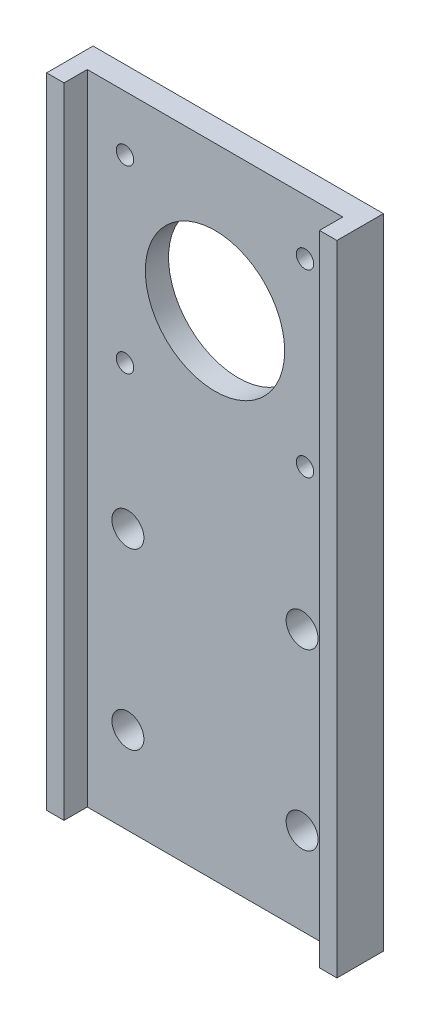
ISO-10303-21;
HEADER;
FILE_DESCRIPTION(('STEP AP214'),'2;1');
FILE_NAME('part.step','',(''),(''),'','','');
FILE_SCHEMA(('AUTOMOTIVE_DESIGN { 1 0 10303 214 1 1 1 1 }'));
ENDSEC;
DATA;
#1=APPLICATION_CONTEXT('core data for automotive mechanical design processes');
#2=APPLICATION_PROTOCOL_DEFINITION('international standard','automotive_design',2000,#1);
#3=PRODUCT_CONTEXT('',#1,'mechanical');
#4=PRODUCT('Part','Part','',(#3));
#5=PRODUCT_RELATED_PRODUCT_CATEGORY('part','',(#4));
#6=PRODUCT_DEFINITION_FORMATION('','',#4);
#7=PRODUCT_DEFINITION_CONTEXT('part definition',#1,'design');
#8=PRODUCT_DEFINITION('design','',#6,#7);
#9=PRODUCT_DEFINITION_SHAPE('','',#8);
#10=(LENGTH_UNIT() NAMED_UNIT(*) SI_UNIT(.MILLI.,.METRE.));
#11=(NAMED_UNIT(*) PLANE_ANGLE_UNIT() SI_UNIT($,.RADIAN.));
#12=(NAMED_UNIT(*) SI_UNIT($,.STERADIAN.) SOLID_ANGLE_UNIT());
#13=UNCERTAINTY_MEASURE_WITH_UNIT(LENGTH_MEASURE(1.E-05),#10,'distance_accuracy_value','');
#14=(GEOMETRIC_REPRESENTATION_CONTEXT(3) GLOBAL_UNCERTAINTY_ASSIGNED_CONTEXT((#13)) GLOBAL_UNIT_ASSIGNED_CONTEXT((#10,
#11,#12)) REPRESENTATION_CONTEXT('',''));
#15=CARTESIAN_POINT('',(0.,0.,0.));
#16=DIRECTION('',(0.,0.,1.));
#17=DIRECTION('',(1.,0.,0.));
#18=AXIS2_PLACEMENT_3D('',#15,#16,#17);
#19=CARTESIAN_POINT('',(0.,0.,4.));
#20=DIRECTION('',(0.,0.,1.));
#21=DIRECTION('',(1.,0.,0.));
#22=AXIS2_PLACEMENT_3D('',#19,#20,#21);
#23=PLANE('',#22);
#24=CARTESIAN_POINT('',(0.,30.,4.));
#25=DIRECTION('',(0.,0.,1.));
#26=DIRECTION('',(1.,0.,0.));
#27=AXIS2_PLACEMENT_3D('',#24,#25,#26);
#28=CIRCLE('',#27,12.);
#29=CARTESIAN_POINT('',(12.,30.,4.));
#30=VERTEX_POINT('',#29);
#31=EDGE_CURVE('E118',#30,#30,#28,.T.);
#32=ORIENTED_EDGE('',*,*,#31,.F.);
#33=EDGE_LOOP('',(#32));
#34=FACE_BOUND('',#33,.T.);
#35=CARTESIAN_POINT('',(15.,-9.99999999999999,4.));
#36=DIRECTION('',(0.,0.,1.));
#37=DIRECTION('',(1.,0.,0.));
#38=AXIS2_PLACEMENT_3D('',#35,#36,#37);
#39=CIRCLE('',#38,2.75);
#40=CARTESIAN_POINT('',(17.75,-9.99999999999999,4.));
#41=VERTEX_POINT('',#40);
#42=EDGE_CURVE('E153',#41,#41,#39,.T.);
#43=ORIENTED_EDGE('',*,*,#42,.F.);
#44=EDGE_LOOP('',(#43));
#45=FACE_BOUND('',#44,.T.);
#46=CARTESIAN_POINT('',(15.,-40.,4.));
#47=DIRECTION('',(0.,0.,1.));
#48=DIRECTION('',(1.,0.,0.));
#49=AXIS2_PLACEMENT_3D('',#46,#47,#48);
#50=CIRCLE('',#49,2.75);
#51=CARTESIAN_POINT('',(17.75,-40.,4.));
#52=VERTEX_POINT('',#51);
#53=EDGE_CURVE('E159',#52,#52,#50,.T.);
#54=ORIENTED_EDGE('',*,*,#53,.F.);
#55=EDGE_LOOP('',(#54));
#56=FACE_BOUND('',#55,.T.);
#57=CARTESIAN_POINT('',(-15.,-9.99999999999999,4.));
#58=DIRECTION('',(0.,0.,1.));
#59=DIRECTION('',(1.,0.,0.));
#60=AXIS2_PLACEMENT_3D('',#57,#58,#59);
#61=CIRCLE('',#60,2.75);
#62=CARTESIAN_POINT('',(-12.25,-9.99999999999999,4.));
#63=VERTEX_POINT('',#62);
#64=EDGE_CURVE('E165',#63,#63,#61,.T.);
#65=ORIENTED_EDGE('',*,*,#64,.F.);
#66=EDGE_LOOP('',(#65));
#67=FACE_BOUND('',#66,.T.);
#68=CARTESIAN_POINT('',(-15.,-40.,4.));
#69=DIRECTION('',(0.,0.,1.));
#70=DIRECTION('',(1.,0.,0.));
#71=AXIS2_PLACEMENT_3D('',#68,#69,#70);
#72=CIRCLE('',#71,2.75);
#73=CARTESIAN_POINT('',(-12.25,-40.,4.));
#74=VERTEX_POINT('',#73);
#75=EDGE_CURVE('E171',#74,#74,#72,.T.);
#76=ORIENTED_EDGE('',*,*,#75,.F.);
#77=EDGE_LOOP('',(#76));
#78=FACE_BOUND('',#77,.T.);
#79=CARTESIAN_POINT('',(15.5,45.5,4.));
#80=DIRECTION('',(0.,0.,1.));
#81=DIRECTION('',(1.,0.,0.));
#82=AXIS2_PLACEMENT_3D('',#79,#80,#81);
#83=CIRCLE('',#82,1.5);
#84=CARTESIAN_POINT('',(17.,45.5,4.));
#85=VERTEX_POINT('',#84);
#86=EDGE_CURVE('E177',#85,#85,#83,.T.);
#87=ORIENTED_EDGE('',*,*,#86,.F.);
#88=EDGE_LOOP('',(#87));
#89=FACE_BOUND('',#88,.T.);
#90=CARTESIAN_POINT('',(15.5,14.5,4.));
#91=DIRECTION('',(0.,0.,1.));
#92=DIRECTION('',(1.,0.,0.));
#93=AXIS2_PLACEMENT_3D('',#90,#91,#92);
#94=CIRCLE('',#93,1.5);
#95=CARTESIAN_POINT('',(17.,14.5,4.));
#96=VERTEX_POINT('',#95);
#97=EDGE_CURVE('E183',#96,#96,#94,.T.);
#98=ORIENTED_EDGE('',*,*,#97,.F.);
#99=EDGE_LOOP('',(#98));
#100=FACE_BOUND('',#99,.T.);
#101=CARTESIAN_POINT('',(-15.5,14.5,4.));
#102=DIRECTION('',(0.,0.,1.));
#103=DIRECTION('',(1.,0.,0.));
#104=AXIS2_PLACEMENT_3D('',#101,#102,#103);
#105=CIRCLE('',#104,1.5);
#106=CARTESIAN_POINT('',(-14.,14.5,4.));
#107=VERTEX_POINT('',#106);
#108=EDGE_CURVE('E189',#107,#107,#105,.T.);
#109=ORIENTED_EDGE('',*,*,#108,.F.);
#110=EDGE_LOOP('',(#109));
#111=FACE_BOUND('',#110,.T.);
#112=CARTESIAN_POINT('',(-15.5,45.5,4.));
#113=DIRECTION('',(0.,0.,1.));
#114=DIRECTION('',(1.,0.,0.));
#115=AXIS2_PLACEMENT_3D('',#112,#113,#114);
#116=CIRCLE('',#115,1.5);
#117=CARTESIAN_POINT('',(-14.,45.5,4.));
#118=VERTEX_POINT('',#117);
#119=EDGE_CURVE('E195',#118,#118,#116,.T.);
#120=ORIENTED_EDGE('',*,*,#119,.F.);
#121=EDGE_LOOP('',(#120));
#122=FACE_BOUND('',#121,.T.);
#123=DIRECTION('',(1.,0.,0.));
#124=VECTOR('',#123,1.);
#125=CARTESIAN_POINT('',(-25.,-55.,4.));
#126=LINE('',#125,#124);
#127=CARTESIAN_POINT('',(-22.,-55.,4.));
#128=VERTEX_POINT('',#127);
#129=CARTESIAN_POINT('',(22.,-55.,4.));
#130=VERTEX_POINT('',#129);
#131=EDGE_CURVE('E55',#128,#130,#126,.T.);
#132=ORIENTED_EDGE('',*,*,#131,.T.);
#133=DIRECTION('',(0.,1.,0.));
#134=VECTOR('',#133,1.);
#135=CARTESIAN_POINT('',(22.,0.,4.));
#136=LINE('',#135,#134);
#137=CARTESIAN_POINT('',(22.,55.,4.));
#138=VERTEX_POINT('',#137);
#139=EDGE_CURVE('E50',#130,#138,#136,.T.);
#140=ORIENTED_EDGE('',*,*,#139,.T.);
#141=DIRECTION('',(-1.,0.,0.));
#142=VECTOR('',#141,1.);
#143=CARTESIAN_POINT('',(-25.,55.,4.));
#144=LINE('',#143,#142);
#145=CARTESIAN_POINT('',(-22.,55.,4.));
#146=VERTEX_POINT('',#145);
#147=EDGE_CURVE('E198',#138,#146,#144,.T.);
#148=ORIENTED_EDGE('',*,*,#147,.T.);
#149=DIRECTION('',(0.,-1.,0.));
#150=VECTOR('',#149,1.);
#151=CARTESIAN_POINT('',(-22.,0.,4.));
#152=LINE('',#151,#150);
#153=EDGE_CURVE('E148',#146,#128,#152,.T.);
#154=ORIENTED_EDGE('',*,*,#153,.T.);
#155=EDGE_LOOP('',(#132,#140,#148,#154));
#156=FACE_BOUND('',#155,.T.);
#157=ADVANCED_FACE('F35',(#34,#45,#56,#67,#78,#89,#100,#111,#122,#156),#23,.T.);
#158=CARTESIAN_POINT('',(25.,55.,4.));
#159=DIRECTION('',(-1.,0.,0.));
#160=DIRECTION('',(0.,-1.,0.));
#161=AXIS2_PLACEMENT_3D('',#158,#159,#160);
#162=PLANE('',#161);
#163=DIRECTION('',(0.,1.,0.));
#164=VECTOR('',#163,1.);
#165=CARTESIAN_POINT('',(25.,55.,0.));
#166=LINE('',#165,#164);
#167=CARTESIAN_POINT('',(25.,-55.,0.));
#168=VERTEX_POINT('',#167);
#169=CARTESIAN_POINT('',(25.,55.,0.));
#170=VERTEX_POINT('',#169);
#171=EDGE_CURVE('E103',#168,#170,#166,.T.);
#172=ORIENTED_EDGE('',*,*,#171,.T.);
#173=DIRECTION('',(0.,0.,-1.));
#174=VECTOR('',#173,1.);
#175=CARTESIAN_POINT('',(25.,55.,4.));
#176=LINE('',#175,#174);
#177=CARTESIAN_POINT('',(25.,55.,8.));
#178=VERTEX_POINT('',#177);
#179=EDGE_CURVE('E11',#178,#170,#176,.T.);
#180=ORIENTED_EDGE('',*,*,#179,.F.);
#181=DIRECTION('',(0.,1.,0.));
#182=VECTOR('',#181,1.);
#183=CARTESIAN_POINT('',(25.,-55.,8.));
#184=LINE('',#183,#182);
#185=CARTESIAN_POINT('',(25.,-55.,8.));
#186=VERTEX_POINT('',#185);
#187=EDGE_CURVE('E101',#186,#178,#184,.T.);
#188=ORIENTED_EDGE('',*,*,#187,.F.);
#189=DIRECTION('',(0.,0.,-1.));
#190=VECTOR('',#189,1.);
#191=CARTESIAN_POINT('',(25.,-55.,4.));
#192=LINE('',#191,#190);
#193=EDGE_CURVE('E202',#186,#168,#192,.T.);
#194=ORIENTED_EDGE('',*,*,#193,.T.);
#195=EDGE_LOOP('',(#172,#180,#188,#194));
#196=FACE_BOUND('',#195,.T.);
#197=ADVANCED_FACE('F37',(#196),#162,.F.);
#198=CARTESIAN_POINT('',(-25.,55.,4.));
#199=DIRECTION('',(0.,-1.,0.));
#200=DIRECTION('',(0.,0.,-1.));
#201=AXIS2_PLACEMENT_3D('',#198,#199,#200);
#202=PLANE('',#201);
#203=DIRECTION('',(-1.,0.,0.));
#204=VECTOR('',#203,1.);
#205=CARTESIAN_POINT('',(-25.,55.,0.));
#206=LINE('',#205,#204);
#207=CARTESIAN_POINT('',(-25.,55.,0.));
#208=VERTEX_POINT('',#207);
#209=EDGE_CURVE('E204',#170,#208,#206,.T.);
#210=ORIENTED_EDGE('',*,*,#209,.T.);
#211=DIRECTION('',(0.,0.,-1.));
#212=VECTOR('',#211,1.);
#213=CARTESIAN_POINT('',(-25.,55.,4.));
#214=LINE('',#213,#212);
#215=CARTESIAN_POINT('',(-25.,55.,8.));
#216=VERTEX_POINT('',#215);
#217=EDGE_CURVE('E43',#216,#208,#214,.T.);
#218=ORIENTED_EDGE('',*,*,#217,.F.);
#219=DIRECTION('',(-1.,0.,0.));
#220=VECTOR('',#219,1.);
#221=CARTESIAN_POINT('',(-25.,55.,8.));
#222=LINE('',#221,#220);
#223=CARTESIAN_POINT('',(-22.,55.,8.));
#224=VERTEX_POINT('',#223);
#225=EDGE_CURVE('E139',#224,#216,#222,.T.);
#226=ORIENTED_EDGE('',*,*,#225,.F.);
#227=DIRECTION('',(0.,0.,-1.));
#228=VECTOR('',#227,1.);
#229=CARTESIAN_POINT('',(-22.,55.,8.));
#230=LINE('',#229,#228);
#231=EDGE_CURVE('E142',#224,#146,#230,.T.);
#232=ORIENTED_EDGE('',*,*,#231,.T.);
#233=ORIENTED_EDGE('',*,*,#147,.F.);
#234=DIRECTION('',(0.,0.,-1.));
#235=VECTOR('',#234,1.);
#236=CARTESIAN_POINT('',(22.,55.,8.));
#237=LINE('',#236,#235);
#238=CARTESIAN_POINT('',(22.,55.,8.));
#239=VERTEX_POINT('',#238);
#240=EDGE_CURVE('E109',#239,#138,#237,.T.);
#241=ORIENTED_EDGE('',*,*,#240,.F.);
#242=DIRECTION('',(-1.,0.,0.));
#243=VECTOR('',#242,1.);
#244=CARTESIAN_POINT('',(25.,55.,8.));
#245=LINE('',#244,#243);
#246=EDGE_CURVE('E106',#178,#239,#245,.T.);
#247=ORIENTED_EDGE('',*,*,#246,.F.);
#248=ORIENTED_EDGE('',*,*,#179,.T.);
#249=EDGE_LOOP('',(#210,#218,#226,#232,#233,#241,#247,#248));
#250=FACE_BOUND('',#249,.T.);
#251=ADVANCED_FACE('F107',(#250),#202,.F.);
#252=CARTESIAN_POINT('',(-25.,55.,4.));
#253=DIRECTION('',(1.,0.,0.));
#254=DIRECTION('',(0.,1.,0.));
#255=AXIS2_PLACEMENT_3D('',#252,#253,#254);
#256=PLANE('',#255);
#257=DIRECTION('',(0.,-1.,0.));
#258=VECTOR('',#257,1.);
#259=CARTESIAN_POINT('',(-25.,55.,0.));
#260=LINE('',#259,#258);
#261=CARTESIAN_POINT('',(-25.,-55.,0.));
#262=VERTEX_POINT('',#261);
#263=EDGE_CURVE('E206',#208,#262,#260,.T.);
#264=ORIENTED_EDGE('',*,*,#263,.T.);
#265=DIRECTION('',(0.,0.,-1.));
#266=VECTOR('',#265,1.);
#267=CARTESIAN_POINT('',(-25.,-55.,4.));
#268=LINE('',#267,#266);
#269=CARTESIAN_POINT('',(-25.,-55.,8.));
#270=VERTEX_POINT('',#269);
#271=EDGE_CURVE('E210',#270,#262,#268,.T.);
#272=ORIENTED_EDGE('',*,*,#271,.F.);
#273=DIRECTION('',(0.,-1.,0.));
#274=VECTOR('',#273,1.);
#275=CARTESIAN_POINT('',(-25.,55.,8.));
#276=LINE('',#275,#274);
#277=EDGE_CURVE('E132',#216,#270,#276,.T.);
#278=ORIENTED_EDGE('',*,*,#277,.F.);
#279=ORIENTED_EDGE('',*,*,#217,.T.);
#280=EDGE_LOOP('',(#264,#272,#278,#279));
#281=FACE_BOUND('',#280,.T.);
#282=ADVANCED_FACE('F216',(#281),#256,.F.);
#283=CARTESIAN_POINT('',(-25.,-55.,4.));
#284=DIRECTION('',(0.,1.,0.));
#285=DIRECTION('',(0.,0.,1.));
#286=AXIS2_PLACEMENT_3D('',#283,#284,#285);
#287=PLANE('',#286);
#288=ORIENTED_EDGE('',*,*,#193,.F.);
#289=DIRECTION('',(1.,0.,0.));
#290=VECTOR('',#289,1.);
#291=CARTESIAN_POINT('',(25.,-55.,8.));
#292=LINE('',#291,#290);
#293=CARTESIAN_POINT('',(22.,-55.,8.));
#294=VERTEX_POINT('',#293);
#295=EDGE_CURVE('E117',#294,#186,#292,.T.);
#296=ORIENTED_EDGE('',*,*,#295,.F.);
#297=DIRECTION('',(0.,0.,-1.));
#298=VECTOR('',#297,1.);
#299=CARTESIAN_POINT('',(22.,-55.,8.));
#300=LINE('',#299,#298);
#301=EDGE_CURVE('E127',#294,#130,#300,.T.);
#302=ORIENTED_EDGE('',*,*,#301,.T.);
#303=ORIENTED_EDGE('',*,*,#131,.F.);
#304=DIRECTION('',(0.,0.,-1.));
#305=VECTOR('',#304,1.);
#306=CARTESIAN_POINT('',(-22.,-55.,8.));
#307=LINE('',#306,#305);
#308=CARTESIAN_POINT('',(-22.,-55.,8.));
#309=VERTEX_POINT('',#308);
#310=EDGE_CURVE('E145',#309,#128,#307,.T.);
#311=ORIENTED_EDGE('',*,*,#310,.F.);
#312=DIRECTION('',(1.,0.,0.));
#313=VECTOR('',#312,1.);
#314=CARTESIAN_POINT('',(-25.,-55.,8.));
#315=LINE('',#314,#313);
#316=EDGE_CURVE('E135',#270,#309,#315,.T.);
#317=ORIENTED_EDGE('',*,*,#316,.F.);
#318=ORIENTED_EDGE('',*,*,#271,.T.);
#319=DIRECTION('',(1.,0.,0.));
#320=VECTOR('',#319,1.);
#321=CARTESIAN_POINT('',(-25.,-55.,0.));
#322=LINE('',#321,#320);
#323=EDGE_CURVE('E200',#262,#168,#322,.T.);
#324=ORIENTED_EDGE('',*,*,#323,.T.);
#325=EDGE_LOOP('',(#288,#296,#302,#303,#311,#317,#318,#324));
#326=FACE_BOUND('',#325,.T.);
#327=ADVANCED_FACE('F223',(#326),#287,.F.);
#328=CARTESIAN_POINT('',(0.,0.,0.));
#329=DIRECTION('',(0.,0.,1.));
#330=DIRECTION('',(1.,0.,0.));
#331=AXIS2_PLACEMENT_3D('',#328,#329,#330);
#332=PLANE('',#331);
#333=CARTESIAN_POINT('',(0.,30.,0.));
#334=DIRECTION('',(0.,0.,1.));
#335=DIRECTION('',(1.,0.,0.));
#336=AXIS2_PLACEMENT_3D('',#333,#334,#335);
#337=CIRCLE('',#336,12.);
#338=CARTESIAN_POINT('',(12.,30.,0.));
#339=VERTEX_POINT('',#338);
#340=EDGE_CURVE('E121',#339,#339,#337,.T.);
#341=ORIENTED_EDGE('',*,*,#340,.T.);
#342=EDGE_LOOP('',(#341));
#343=FACE_BOUND('',#342,.T.);
#344=ORIENTED_EDGE('',*,*,#171,.F.);
#345=ORIENTED_EDGE('',*,*,#323,.F.);
#346=ORIENTED_EDGE('',*,*,#263,.F.);
#347=ORIENTED_EDGE('',*,*,#209,.F.);
#348=EDGE_LOOP('',(#344,#345,#346,#347));
#349=FACE_BOUND('',#348,.T.);
#350=CARTESIAN_POINT('',(15.,-9.99999999999999,0.));
#351=DIRECTION('',(0.,0.,1.));
#352=DIRECTION('',(-1.,0.,0.));
#353=AXIS2_PLACEMENT_3D('',#350,#351,#352);
#354=CIRCLE('',#353,2.75);
#355=CARTESIAN_POINT('',(12.25,-9.99999999999999,0.));
#356=VERTEX_POINT('',#355);
#357=EDGE_CURVE('E150',#356,#356,#354,.T.);
#358=ORIENTED_EDGE('',*,*,#357,.T.);
#359=EDGE_LOOP('',(#358));
#360=FACE_BOUND('',#359,.T.);
#361=CARTESIAN_POINT('',(15.,-40.,0.));
#362=DIRECTION('',(0.,0.,1.));
#363=DIRECTION('',(-1.,0.,0.));
#364=AXIS2_PLACEMENT_3D('',#361,#362,#363);
#365=CIRCLE('',#364,2.75);
#366=CARTESIAN_POINT('',(12.25,-40.,0.));
#367=VERTEX_POINT('',#366);
#368=EDGE_CURVE('E156',#367,#367,#365,.T.);
#369=ORIENTED_EDGE('',*,*,#368,.T.);
#370=EDGE_LOOP('',(#369));
#371=FACE_BOUND('',#370,.T.);
#372=CARTESIAN_POINT('',(-15.,-9.99999999999999,0.));
#373=DIRECTION('',(0.,0.,1.));
#374=DIRECTION('',(1.,0.,0.));
#375=AXIS2_PLACEMENT_3D('',#372,#373,#374);
#376=CIRCLE('',#375,2.75);
#377=CARTESIAN_POINT('',(-12.25,-9.99999999999999,0.));
#378=VERTEX_POINT('',#377);
#379=EDGE_CURVE('E162',#378,#378,#376,.T.);
#380=ORIENTED_EDGE('',*,*,#379,.T.);
#381=EDGE_LOOP('',(#380));
#382=FACE_BOUND('',#381,.T.);
#383=CARTESIAN_POINT('',(-15.,-40.,0.));
#384=DIRECTION('',(0.,0.,1.));
#385=DIRECTION('',(1.,0.,0.));
#386=AXIS2_PLACEMENT_3D('',#383,#384,#385);
#387=CIRCLE('',#386,2.75);
#388=CARTESIAN_POINT('',(-12.25,-40.,0.));
#389=VERTEX_POINT('',#388);
#390=EDGE_CURVE('E168',#389,#389,#387,.T.);
#391=ORIENTED_EDGE('',*,*,#390,.T.);
#392=EDGE_LOOP('',(#391));
#393=FACE_BOUND('',#392,.T.);
#394=CARTESIAN_POINT('',(15.5,45.5,0.));
#395=DIRECTION('',(0.,0.,1.));
#396=DIRECTION('',(-1.,0.,0.));
#397=AXIS2_PLACEMENT_3D('',#394,#395,#396);
#398=CIRCLE('',#397,1.5);
#399=CARTESIAN_POINT('',(14.,45.5,0.));
#400=VERTEX_POINT('',#399);
#401=EDGE_CURVE('E174',#400,#400,#398,.T.);
#402=ORIENTED_EDGE('',*,*,#401,.T.);
#403=EDGE_LOOP('',(#402));
#404=FACE_BOUND('',#403,.T.);
#405=CARTESIAN_POINT('',(15.5,14.5,0.));
#406=DIRECTION('',(0.,0.,1.));
#407=DIRECTION('',(-1.,0.,0.));
#408=AXIS2_PLACEMENT_3D('',#405,#406,#407);
#409=CIRCLE('',#408,1.5);
#410=CARTESIAN_POINT('',(14.,14.5,0.));
#411=VERTEX_POINT('',#410);
#412=EDGE_CURVE('E180',#411,#411,#409,.T.);
#413=ORIENTED_EDGE('',*,*,#412,.T.);
#414=EDGE_LOOP('',(#413));
#415=FACE_BOUND('',#414,.T.);
#416=CARTESIAN_POINT('',(-15.5,14.5,0.));
#417=DIRECTION('',(0.,0.,1.));
#418=DIRECTION('',(1.,0.,0.));
#419=AXIS2_PLACEMENT_3D('',#416,#417,#418);
#420=CIRCLE('',#419,1.5);
#421=CARTESIAN_POINT('',(-14.,14.5,0.));
#422=VERTEX_POINT('',#421);
#423=EDGE_CURVE('E186',#422,#422,#420,.T.);
#424=ORIENTED_EDGE('',*,*,#423,.T.);
#425=EDGE_LOOP('',(#424));
#426=FACE_BOUND('',#425,.T.);
#427=CARTESIAN_POINT('',(-15.5,45.5,0.));
#428=DIRECTION('',(0.,0.,1.));
#429=DIRECTION('',(1.,0.,0.));
#430=AXIS2_PLACEMENT_3D('',#427,#428,#429);
#431=CIRCLE('',#430,1.5);
#432=CARTESIAN_POINT('',(-14.,45.5,0.));
#433=VERTEX_POINT('',#432);
#434=EDGE_CURVE('E192',#433,#433,#431,.T.);
#435=ORIENTED_EDGE('',*,*,#434,.T.);
#436=EDGE_LOOP('',(#435));
#437=FACE_BOUND('',#436,.T.);
#438=ADVANCED_FACE('F220',(#343,#349,#360,#371,#382,#393,#404,#415,#426,#437),#332,.F.);
#439=CARTESIAN_POINT('',(-15.5,45.5,4.001));
#440=DIRECTION('',(0.,0.,-1.));
#441=DIRECTION('',(-1.,0.,0.));
#442=AXIS2_PLACEMENT_3D('',#439,#440,#441);
#443=CYLINDRICAL_SURFACE('',#442,1.5);
#444=ORIENTED_EDGE('',*,*,#119,.T.);
#445=EDGE_LOOP('',(#444));
#446=FACE_BOUND('',#445,.T.);
#447=ORIENTED_EDGE('',*,*,#434,.F.);
#448=EDGE_LOOP('',(#447));
#449=FACE_BOUND('',#448,.T.);
#450=ADVANCED_FACE('F257',(#446,#449),#443,.F.);
#451=CARTESIAN_POINT('',(-15.5,14.5,4.001));
#452=DIRECTION('',(0.,0.,-1.));
#453=DIRECTION('',(-1.,0.,0.));
#454=AXIS2_PLACEMENT_3D('',#451,#452,#453);
#455=CYLINDRICAL_SURFACE('',#454,1.5);
#456=ORIENTED_EDGE('',*,*,#108,.T.);
#457=EDGE_LOOP('',(#456));
#458=FACE_BOUND('',#457,.T.);
#459=ORIENTED_EDGE('',*,*,#423,.F.);
#460=EDGE_LOOP('',(#459));
#461=FACE_BOUND('',#460,.T.);
#462=ADVANCED_FACE('F293',(#458,#461),#455,.F.);
#463=CARTESIAN_POINT('',(15.5,14.5,4.001));
#464=DIRECTION('',(0.,0.,-1.));
#465=DIRECTION('',(-1.,0.,0.));
#466=AXIS2_PLACEMENT_3D('',#463,#464,#465);
#467=CYLINDRICAL_SURFACE('',#466,1.5);
#468=ORIENTED_EDGE('',*,*,#97,.T.);
#469=EDGE_LOOP('',(#468));
#470=FACE_BOUND('',#469,.T.);
#471=ORIENTED_EDGE('',*,*,#412,.F.);
#472=EDGE_LOOP('',(#471));
#473=FACE_BOUND('',#472,.T.);
#474=ADVANCED_FACE('F299',(#470,#473),#467,.F.);
#475=CARTESIAN_POINT('',(15.5,45.5,4.001));
#476=DIRECTION('',(0.,0.,-1.));
#477=DIRECTION('',(-1.,0.,0.));
#478=AXIS2_PLACEMENT_3D('',#475,#476,#477);
#479=CYLINDRICAL_SURFACE('',#478,1.5);
#480=ORIENTED_EDGE('',*,*,#86,.T.);
#481=EDGE_LOOP('',(#480));
#482=FACE_BOUND('',#481,.T.);
#483=ORIENTED_EDGE('',*,*,#401,.F.);
#484=EDGE_LOOP('',(#483));
#485=FACE_BOUND('',#484,.T.);
#486=ADVANCED_FACE('F306',(#482,#485),#479,.F.);
#487=CARTESIAN_POINT('',(-15.,-40.,4.001));
#488=DIRECTION('',(0.,0.,-1.));
#489=DIRECTION('',(-1.,0.,0.));
#490=AXIS2_PLACEMENT_3D('',#487,#488,#489);
#491=CYLINDRICAL_SURFACE('',#490,2.75);
#492=ORIENTED_EDGE('',*,*,#75,.T.);
#493=EDGE_LOOP('',(#492));
#494=FACE_BOUND('',#493,.T.);
#495=ORIENTED_EDGE('',*,*,#390,.F.);
#496=EDGE_LOOP('',(#495));
#497=FACE_BOUND('',#496,.T.);
#498=ADVANCED_FACE('F314',(#494,#497),#491,.F.);
#499=CARTESIAN_POINT('',(-15.,-9.99999999999999,4.001));
#500=DIRECTION('',(0.,0.,-1.));
#501=DIRECTION('',(-1.,0.,0.));
#502=AXIS2_PLACEMENT_3D('',#499,#500,#501);
#503=CYLINDRICAL_SURFACE('',#502,2.75);
#504=ORIENTED_EDGE('',*,*,#64,.T.);
#505=EDGE_LOOP('',(#504));
#506=FACE_BOUND('',#505,.T.);
#507=ORIENTED_EDGE('',*,*,#379,.F.);
#508=EDGE_LOOP('',(#507));
#509=FACE_BOUND('',#508,.T.);
#510=ADVANCED_FACE('F322',(#506,#509),#503,.F.);
#511=CARTESIAN_POINT('',(15.,-40.,4.001));
#512=DIRECTION('',(0.,0.,-1.));
#513=DIRECTION('',(-1.,0.,0.));
#514=AXIS2_PLACEMENT_3D('',#511,#512,#513);
#515=CYLINDRICAL_SURFACE('',#514,2.75);
#516=ORIENTED_EDGE('',*,*,#53,.T.);
#517=EDGE_LOOP('',(#516));
#518=FACE_BOUND('',#517,.T.);
#519=ORIENTED_EDGE('',*,*,#368,.F.);
#520=EDGE_LOOP('',(#519));
#521=FACE_BOUND('',#520,.T.);
#522=ADVANCED_FACE('F330',(#518,#521),#515,.F.);
#523=CARTESIAN_POINT('',(15.,-9.99999999999999,4.001));
#524=DIRECTION('',(0.,0.,-1.));
#525=DIRECTION('',(-1.,0.,0.));
#526=AXIS2_PLACEMENT_3D('',#523,#524,#525);
#527=CYLINDRICAL_SURFACE('',#526,2.75);
#528=ORIENTED_EDGE('',*,*,#42,.T.);
#529=EDGE_LOOP('',(#528));
#530=FACE_BOUND('',#529,.T.);
#531=ORIENTED_EDGE('',*,*,#357,.F.);
#532=EDGE_LOOP('',(#531));
#533=FACE_BOUND('',#532,.T.);
#534=ADVANCED_FACE('F338',(#530,#533),#527,.F.);
#535=CARTESIAN_POINT('',(-22.,55.,8.));
#536=DIRECTION('',(-1.,0.,0.));
#537=DIRECTION('',(0.,-1.,0.));
#538=AXIS2_PLACEMENT_3D('',#535,#536,#537);
#539=PLANE('',#538);
#540=ORIENTED_EDGE('',*,*,#153,.F.);
#541=ORIENTED_EDGE('',*,*,#231,.F.);
#542=DIRECTION('',(0.,1.,0.));
#543=VECTOR('',#542,1.);
#544=CARTESIAN_POINT('',(-22.,55.,8.));
#545=LINE('',#544,#543);
#546=EDGE_CURVE('E137',#309,#224,#545,.T.);
#547=ORIENTED_EDGE('',*,*,#546,.F.);
#548=ORIENTED_EDGE('',*,*,#310,.T.);
#549=EDGE_LOOP('',(#540,#541,#547,#548));
#550=FACE_BOUND('',#549,.T.);
#551=ADVANCED_FACE('F232',(#550),#539,.F.);
#552=CARTESIAN_POINT('',(0.,0.,8.));
#553=DIRECTION('',(0.,0.,1.));
#554=DIRECTION('',(1.,0.,0.));
#555=AXIS2_PLACEMENT_3D('',#552,#553,#554);
#556=PLANE('',#555);
#557=ORIENTED_EDGE('',*,*,#277,.T.);
#558=ORIENTED_EDGE('',*,*,#316,.T.);
#559=ORIENTED_EDGE('',*,*,#546,.T.);
#560=ORIENTED_EDGE('',*,*,#225,.T.);
#561=EDGE_LOOP('',(#557,#558,#559,#560));
#562=FACE_BOUND('',#561,.T.);
#563=ADVANCED_FACE('F228',(#562),#556,.T.);
#564=CARTESIAN_POINT('',(22.,-55.,8.));
#565=DIRECTION('',(1.,0.,0.));
#566=DIRECTION('',(0.,0.,-1.));
#567=AXIS2_PLACEMENT_3D('',#564,#565,#566);
#568=PLANE('',#567);
#569=ORIENTED_EDGE('',*,*,#139,.F.);
#570=ORIENTED_EDGE('',*,*,#301,.F.);
#571=DIRECTION('',(0.,-1.,0.));
#572=VECTOR('',#571,1.);
#573=CARTESIAN_POINT('',(22.,-55.,8.));
#574=LINE('',#573,#572);
#575=EDGE_CURVE('E112',#239,#294,#574,.T.);
#576=ORIENTED_EDGE('',*,*,#575,.F.);
#577=ORIENTED_EDGE('',*,*,#240,.T.);
#578=EDGE_LOOP('',(#569,#570,#576,#577));
#579=FACE_BOUND('',#578,.T.);
#580=ADVANCED_FACE('F235',(#579),#568,.F.);
#581=CARTESIAN_POINT('',(0.,0.,8.));
#582=DIRECTION('',(0.,0.,1.));
#583=DIRECTION('',(1.,0.,0.));
#584=AXIS2_PLACEMENT_3D('',#581,#582,#583);
#585=PLANE('',#584);
#586=ORIENTED_EDGE('',*,*,#187,.T.);
#587=ORIENTED_EDGE('',*,*,#246,.T.);
#588=ORIENTED_EDGE('',*,*,#575,.T.);
#589=ORIENTED_EDGE('',*,*,#295,.T.);
#590=EDGE_LOOP('',(#586,#587,#588,#589));
#591=FACE_BOUND('',#590,.T.);
#592=ADVANCED_FACE('F115',(#591),#585,.T.);
#593=CARTESIAN_POINT('',(0.,30.,8.001));
#594=DIRECTION('',(0.,0.,-1.));
#595=DIRECTION('',(-1.,0.,0.));
#596=AXIS2_PLACEMENT_3D('',#593,#594,#595);
#597=CYLINDRICAL_SURFACE('',#596,12.);
#598=ORIENTED_EDGE('',*,*,#31,.T.);
#599=EDGE_LOOP('',(#598));
#600=FACE_BOUND('',#599,.T.);
#601=ORIENTED_EDGE('',*,*,#340,.F.);
#602=EDGE_LOOP('',(#601));
#603=FACE_BOUND('',#602,.T.);
#604=ADVANCED_FACE('F242',(#600,#603),#597,.F.);
#605=CLOSED_SHELL('',(#157,#197,#251,#282,#327,#438,#450,#462,#474,#486,#498,#510,#522,#534,
#551,#563,#580,#592,#604));
#606=MANIFOLD_SOLID_BREP('B2',#605);
#607=ADVANCED_BREP_SHAPE_REPRESENTATION('',(#18,#606),#14);
#608=SHAPE_DEFINITION_REPRESENTATION(#9,#607);
ENDSEC;
END-ISO-10303-21;
